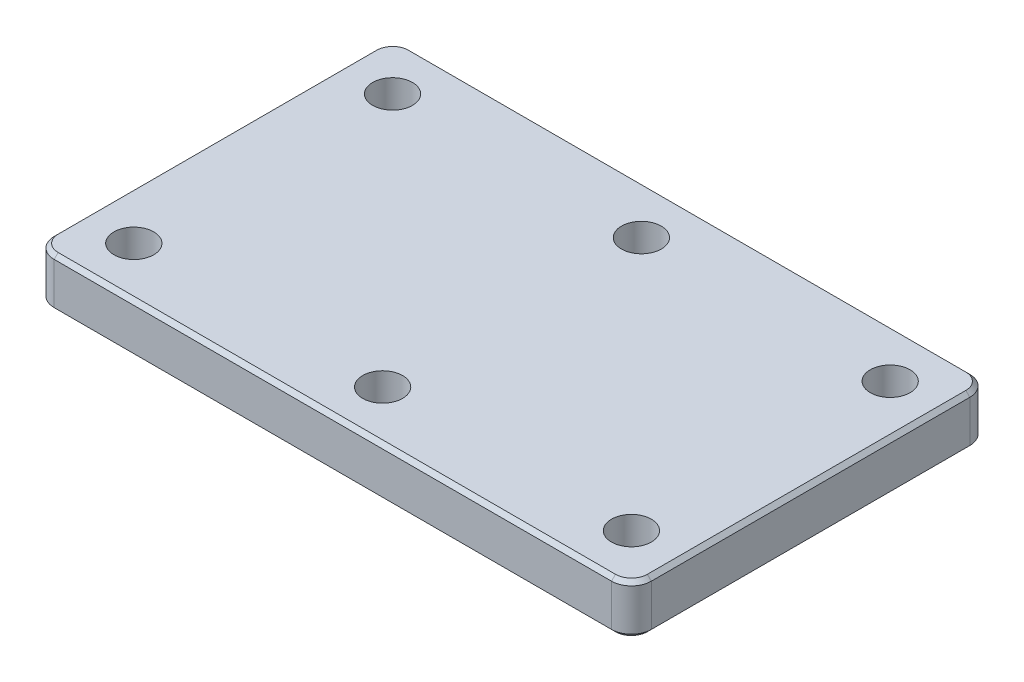
ISO-10303-21;
HEADER;
FILE_DESCRIPTION(('STEP AP214'),'2;1');
FILE_NAME('part.step','',(''),(''),'','','');
FILE_SCHEMA(('AUTOMOTIVE_DESIGN { 1 0 10303 214 1 1 1 1 }'));
ENDSEC;
DATA;
#1=APPLICATION_CONTEXT('core data for automotive mechanical design processes');
#2=APPLICATION_PROTOCOL_DEFINITION('international standard','automotive_design',2000,#1);
#3=PRODUCT_CONTEXT('',#1,'mechanical');
#4=PRODUCT('Part','Part','',(#3));
#5=PRODUCT_RELATED_PRODUCT_CATEGORY('part','',(#4));
#6=PRODUCT_DEFINITION_FORMATION('','',#4);
#7=PRODUCT_DEFINITION_CONTEXT('part definition',#1,'design');
#8=PRODUCT_DEFINITION('design','',#6,#7);
#9=PRODUCT_DEFINITION_SHAPE('','',#8);
#10=(LENGTH_UNIT() NAMED_UNIT(*) SI_UNIT(.MILLI.,.METRE.));
#11=(NAMED_UNIT(*) PLANE_ANGLE_UNIT() SI_UNIT($,.RADIAN.));
#12=(NAMED_UNIT(*) SI_UNIT($,.STERADIAN.) SOLID_ANGLE_UNIT());
#13=UNCERTAINTY_MEASURE_WITH_UNIT(LENGTH_MEASURE(1.E-05),#10,'distance_accuracy_value','');
#14=(GEOMETRIC_REPRESENTATION_CONTEXT(3) GLOBAL_UNCERTAINTY_ASSIGNED_CONTEXT((#13)) GLOBAL_UNIT_ASSIGNED_CONTEXT((#10,
#11,#12)) REPRESENTATION_CONTEXT('',''));
#15=CARTESIAN_POINT('',(0.,0.,0.));
#16=DIRECTION('',(0.,0.,1.));
#17=DIRECTION('',(1.,0.,0.));
#18=AXIS2_PLACEMENT_3D('',#15,#16,#17);
#19=CARTESIAN_POINT('',(290.,12.5,170.));
#20=DIRECTION('',(0.,1.,0.));
#21=DIRECTION('',(0.,0.,1.));
#22=AXIS2_PLACEMENT_3D('',#19,#20,#21);
#23=PLANE('',#22);
#24=CARTESIAN_POINT('',(290.,12.5,10.));
#25=DIRECTION('',(0.,1.,0.));
#26=DIRECTION('',(0.,0.,1.));
#27=AXIS2_PLACEMENT_3D('',#24,#25,#26);
#28=CIRCLE('',#27,8.00000000000006);
#29=CARTESIAN_POINT('',(298.,12.5,10.0000000000001));
#30=VERTEX_POINT('',#29);
#31=CARTESIAN_POINT('',(290.,12.5,1.99999999999994));
#32=VERTEX_POINT('',#31);
#33=EDGE_CURVE('E60',#30,#32,#28,.T.);
#34=ORIENTED_EDGE('',*,*,#33,.T.);
#35=DIRECTION('',(-1.,0.,0.));
#36=VECTOR('',#35,1.);
#37=CARTESIAN_POINT('',(10.,12.5,1.99999999999995));
#38=LINE('',#37,#36);
#39=CARTESIAN_POINT('',(10.,12.5,1.99999999999995));
#40=VERTEX_POINT('',#39);
#41=EDGE_CURVE('E11',#32,#40,#38,.T.);
#42=ORIENTED_EDGE('',*,*,#41,.T.);
#43=CARTESIAN_POINT('',(10.,12.5,10.));
#44=DIRECTION('',(0.,1.,0.));
#45=DIRECTION('',(0.,0.,1.));
#46=AXIS2_PLACEMENT_3D('',#43,#44,#45);
#47=CIRCLE('',#46,8.00000000000005);
#48=CARTESIAN_POINT('',(1.99999999999995,12.5,10.0000000000001));
#49=VERTEX_POINT('',#48);
#50=EDGE_CURVE('E45',#40,#49,#47,.T.);
#51=ORIENTED_EDGE('',*,*,#50,.T.);
#52=DIRECTION('',(0.,0.,1.));
#53=VECTOR('',#52,1.);
#54=CARTESIAN_POINT('',(1.99999999999995,12.5,170.));
#55=LINE('',#54,#53);
#56=CARTESIAN_POINT('',(1.99999999999994,12.5,170.));
#57=VERTEX_POINT('',#56);
#58=EDGE_CURVE('E242',#49,#57,#55,.T.);
#59=ORIENTED_EDGE('',*,*,#58,.T.);
#60=CARTESIAN_POINT('',(10.,12.5,170.));
#61=DIRECTION('',(0.,1.,0.));
#62=DIRECTION('',(0.,0.,1.));
#63=AXIS2_PLACEMENT_3D('',#60,#61,#62);
#64=CIRCLE('',#63,8.00000000000006);
#65=CARTESIAN_POINT('',(10.0000000000001,12.5,178.));
#66=VERTEX_POINT('',#65);
#67=EDGE_CURVE('E238',#57,#66,#64,.T.);
#68=ORIENTED_EDGE('',*,*,#67,.T.);
#69=DIRECTION('',(1.,0.,0.));
#70=VECTOR('',#69,1.);
#71=CARTESIAN_POINT('',(290.,12.5,178.));
#72=LINE('',#71,#70);
#73=CARTESIAN_POINT('',(290.,12.5,178.));
#74=VERTEX_POINT('',#73);
#75=EDGE_CURVE('E234',#66,#74,#72,.T.);
#76=ORIENTED_EDGE('',*,*,#75,.T.);
#77=CARTESIAN_POINT('',(290.,12.5,170.));
#78=DIRECTION('',(0.,1.,0.));
#79=DIRECTION('',(0.,0.,1.));
#80=AXIS2_PLACEMENT_3D('',#77,#78,#79);
#81=CIRCLE('',#80,8.00000000000006);
#82=CARTESIAN_POINT('',(298.,12.5,170.));
#83=VERTEX_POINT('',#82);
#84=EDGE_CURVE('E236',#74,#83,#81,.T.);
#85=ORIENTED_EDGE('',*,*,#84,.T.);
#86=DIRECTION('',(0.,0.,-1.));
#87=VECTOR('',#86,1.);
#88=CARTESIAN_POINT('',(298.,12.5,10.0000000000001));
#89=LINE('',#88,#87);
#90=EDGE_CURVE('E240',#83,#30,#89,.T.);
#91=ORIENTED_EDGE('',*,*,#90,.T.);
#92=EDGE_LOOP('',(#34,#42,#51,#59,#68,#76,#85,#91));
#93=FACE_BOUND('',#92,.T.);
#94=CARTESIAN_POINT('',(150.,12.5,25.));
#95=DIRECTION('',(0.,1.,0.));
#96=DIRECTION('',(0.,0.,1.));
#97=AXIS2_PLACEMENT_3D('',#94,#95,#96);
#98=CIRCLE('',#97,10.);
#99=CARTESIAN_POINT('',(150.,12.5,35.));
#100=VERTEX_POINT('',#99);
#101=EDGE_CURVE('E378',#100,#100,#98,.T.);
#102=ORIENTED_EDGE('',*,*,#101,.F.);
#103=EDGE_LOOP('',(#102));
#104=FACE_BOUND('',#103,.T.);
#105=CARTESIAN_POINT('',(275.,12.5,25.));
#106=DIRECTION('',(0.,1.,0.));
#107=DIRECTION('',(0.,0.,1.));
#108=AXIS2_PLACEMENT_3D('',#105,#106,#107);
#109=CIRCLE('',#108,9.99999999999998);
#110=CARTESIAN_POINT('',(275.,12.5,35.));
#111=VERTEX_POINT('',#110);
#112=EDGE_CURVE('E382',#111,#111,#109,.T.);
#113=ORIENTED_EDGE('',*,*,#112,.F.);
#114=EDGE_LOOP('',(#113));
#115=FACE_BOUND('',#114,.T.);
#116=CARTESIAN_POINT('',(25.,12.5,25.));
#117=DIRECTION('',(0.,1.,0.));
#118=DIRECTION('',(0.,0.,1.));
#119=AXIS2_PLACEMENT_3D('',#116,#117,#118);
#120=CIRCLE('',#119,10.);
#121=CARTESIAN_POINT('',(25.,12.5,35.));
#122=VERTEX_POINT('',#121);
#123=EDGE_CURVE('E311',#122,#122,#120,.T.);
#124=ORIENTED_EDGE('',*,*,#123,.F.);
#125=EDGE_LOOP('',(#124));
#126=FACE_BOUND('',#125,.T.);
#127=CARTESIAN_POINT('',(25.,12.5,155.));
#128=DIRECTION('',(0.,1.,0.));
#129=DIRECTION('',(0.,0.,1.));
#130=AXIS2_PLACEMENT_3D('',#127,#128,#129);
#131=CIRCLE('',#130,10.);
#132=CARTESIAN_POINT('',(25.,12.5,165.));
#133=VERTEX_POINT('',#132);
#134=EDGE_CURVE('E389',#133,#133,#131,.T.);
#135=ORIENTED_EDGE('',*,*,#134,.F.);
#136=EDGE_LOOP('',(#135));
#137=FACE_BOUND('',#136,.T.);
#138=CARTESIAN_POINT('',(275.,12.5,155.));
#139=DIRECTION('',(0.,1.,0.));
#140=DIRECTION('',(0.,0.,1.));
#141=AXIS2_PLACEMENT_3D('',#138,#139,#140);
#142=CIRCLE('',#141,9.99999999999998);
#143=CARTESIAN_POINT('',(275.,12.5,165.));
#144=VERTEX_POINT('',#143);
#145=EDGE_CURVE('E393',#144,#144,#142,.T.);
#146=ORIENTED_EDGE('',*,*,#145,.F.);
#147=EDGE_LOOP('',(#146));
#148=FACE_BOUND('',#147,.T.);
#149=CARTESIAN_POINT('',(150.,12.5,155.));
#150=DIRECTION('',(0.,1.,0.));
#151=DIRECTION('',(0.,0.,1.));
#152=AXIS2_PLACEMENT_3D('',#149,#150,#151);
#153=CIRCLE('',#152,10.);
#154=CARTESIAN_POINT('',(150.,12.5,165.));
#155=VERTEX_POINT('',#154);
#156=EDGE_CURVE('E396',#155,#155,#153,.T.);
#157=ORIENTED_EDGE('',*,*,#156,.F.);
#158=EDGE_LOOP('',(#157));
#159=FACE_BOUND('',#158,.T.);
#160=ADVANCED_FACE('F35',(#93,#104,#115,#126,#137,#148,#159),#23,.T.);
#161=CARTESIAN_POINT('',(290.,-12.5,170.));
#162=DIRECTION('',(0.,1.,0.));
#163=DIRECTION('',(0.,0.,1.));
#164=AXIS2_PLACEMENT_3D('',#161,#162,#163);
#165=PLANE('',#164);
#166=DIRECTION('',(1.,0.,0.));
#167=VECTOR('',#166,1.);
#168=CARTESIAN_POINT('',(290.,-12.5,2.00000000000003));
#169=LINE('',#168,#167);
#170=CARTESIAN_POINT('',(10.,-12.5,2.00000000000003));
#171=VERTEX_POINT('',#170);
#172=CARTESIAN_POINT('',(290.,-12.5,2.00000000000003));
#173=VERTEX_POINT('',#172);
#174=EDGE_CURVE('E205',#171,#173,#169,.T.);
#175=ORIENTED_EDGE('',*,*,#174,.T.);
#176=CARTESIAN_POINT('',(290.,-12.5,10.));
#177=DIRECTION('',(0.,1.,0.));
#178=DIRECTION('',(0.,0.,1.));
#179=AXIS2_PLACEMENT_3D('',#176,#177,#178);
#180=CIRCLE('',#179,7.99999999999995);
#181=CARTESIAN_POINT('',(298.,-12.5,10.0000000000001));
#182=VERTEX_POINT('',#181);
#183=EDGE_CURVE('E178',#173,#182,#180,.F.);
#184=ORIENTED_EDGE('',*,*,#183,.T.);
#185=DIRECTION('',(0.,0.,1.));
#186=VECTOR('',#185,1.);
#187=CARTESIAN_POINT('',(298.,-12.5,170.));
#188=LINE('',#187,#186);
#189=CARTESIAN_POINT('',(298.,-12.5,170.));
#190=VERTEX_POINT('',#189);
#191=EDGE_CURVE('E203',#182,#190,#188,.T.);
#192=ORIENTED_EDGE('',*,*,#191,.T.);
#193=CARTESIAN_POINT('',(290.,-12.5,170.));
#194=DIRECTION('',(0.,1.,0.));
#195=DIRECTION('',(0.,0.,1.));
#196=AXIS2_PLACEMENT_3D('',#193,#194,#195);
#197=CIRCLE('',#196,7.99999999999998);
#198=CARTESIAN_POINT('',(290.,-12.5,178.));
#199=VERTEX_POINT('',#198);
#200=EDGE_CURVE('E199',#190,#199,#197,.F.);
#201=ORIENTED_EDGE('',*,*,#200,.T.);
#202=DIRECTION('',(-1.,0.,0.));
#203=VECTOR('',#202,1.);
#204=CARTESIAN_POINT('',(290.,-12.5,178.));
#205=LINE('',#204,#203);
#206=CARTESIAN_POINT('',(10.0000000000001,-12.5,178.));
#207=VERTEX_POINT('',#206);
#208=EDGE_CURVE('E195',#199,#207,#205,.T.);
#209=ORIENTED_EDGE('',*,*,#208,.T.);
#210=CARTESIAN_POINT('',(10.,-12.5,170.));
#211=DIRECTION('',(0.,1.,0.));
#212=DIRECTION('',(0.,0.,1.));
#213=AXIS2_PLACEMENT_3D('',#210,#211,#212);
#214=CIRCLE('',#213,7.99999999999998);
#215=CARTESIAN_POINT('',(2.00000000000002,-12.5,170.));
#216=VERTEX_POINT('',#215);
#217=EDGE_CURVE('E193',#207,#216,#214,.F.);
#218=ORIENTED_EDGE('',*,*,#217,.T.);
#219=DIRECTION('',(0.,0.,-1.));
#220=VECTOR('',#219,1.);
#221=CARTESIAN_POINT('',(2.,-12.5,170.));
#222=LINE('',#221,#220);
#223=CARTESIAN_POINT('',(2.,-12.5,10.0000000000001));
#224=VERTEX_POINT('',#223);
#225=EDGE_CURVE('E197',#216,#224,#222,.T.);
#226=ORIENTED_EDGE('',*,*,#225,.T.);
#227=CARTESIAN_POINT('',(10.,-12.5,10.));
#228=DIRECTION('',(0.,1.,0.));
#229=DIRECTION('',(0.,0.,1.));
#230=AXIS2_PLACEMENT_3D('',#227,#228,#229);
#231=CIRCLE('',#230,7.99999999999997);
#232=EDGE_CURVE('E201',#224,#171,#231,.F.);
#233=ORIENTED_EDGE('',*,*,#232,.T.);
#234=EDGE_LOOP('',(#175,#184,#192,#201,#209,#218,#226,#233));
#235=FACE_BOUND('',#234,.T.);
#236=CARTESIAN_POINT('',(25.,-12.5,25.));
#237=DIRECTION('',(0.,1.,0.));
#238=DIRECTION('',(0.,0.,1.));
#239=AXIS2_PLACEMENT_3D('',#236,#237,#238);
#240=CIRCLE('',#239,10.);
#241=CARTESIAN_POINT('',(25.,-12.5,35.));
#242=VERTEX_POINT('',#241);
#243=EDGE_CURVE('E416',#242,#242,#240,.T.);
#244=ORIENTED_EDGE('',*,*,#243,.T.);
#245=EDGE_LOOP('',(#244));
#246=FACE_BOUND('',#245,.T.);
#247=CARTESIAN_POINT('',(25.,-12.5,155.));
#248=DIRECTION('',(0.,1.,0.));
#249=DIRECTION('',(0.,0.,1.));
#250=AXIS2_PLACEMENT_3D('',#247,#248,#249);
#251=CIRCLE('',#250,10.);
#252=CARTESIAN_POINT('',(25.,-12.5,165.));
#253=VERTEX_POINT('',#252);
#254=EDGE_CURVE('E412',#253,#253,#251,.T.);
#255=ORIENTED_EDGE('',*,*,#254,.T.);
#256=EDGE_LOOP('',(#255));
#257=FACE_BOUND('',#256,.T.);
#258=CARTESIAN_POINT('',(275.,-12.5,25.));
#259=DIRECTION('',(0.,1.,0.));
#260=DIRECTION('',(0.,0.,1.));
#261=AXIS2_PLACEMENT_3D('',#258,#259,#260);
#262=CIRCLE('',#261,9.99999999999998);
#263=CARTESIAN_POINT('',(275.,-12.5,35.));
#264=VERTEX_POINT('',#263);
#265=EDGE_CURVE('E408',#264,#264,#262,.T.);
#266=ORIENTED_EDGE('',*,*,#265,.T.);
#267=EDGE_LOOP('',(#266));
#268=FACE_BOUND('',#267,.T.);
#269=CARTESIAN_POINT('',(275.,-12.5,155.));
#270=DIRECTION('',(0.,1.,0.));
#271=DIRECTION('',(0.,0.,1.));
#272=AXIS2_PLACEMENT_3D('',#269,#270,#271);
#273=CIRCLE('',#272,9.99999999999998);
#274=CARTESIAN_POINT('',(275.,-12.5,165.));
#275=VERTEX_POINT('',#274);
#276=EDGE_CURVE('E405',#275,#275,#273,.T.);
#277=ORIENTED_EDGE('',*,*,#276,.T.);
#278=EDGE_LOOP('',(#277));
#279=FACE_BOUND('',#278,.T.);
#280=CARTESIAN_POINT('',(150.,-12.5,25.));
#281=DIRECTION('',(0.,1.,0.));
#282=DIRECTION('',(0.,0.,1.));
#283=AXIS2_PLACEMENT_3D('',#280,#281,#282);
#284=CIRCLE('',#283,10.);
#285=CARTESIAN_POINT('',(150.,-12.5,35.));
#286=VERTEX_POINT('',#285);
#287=EDGE_CURVE('E398',#286,#286,#284,.T.);
#288=ORIENTED_EDGE('',*,*,#287,.T.);
#289=EDGE_LOOP('',(#288));
#290=FACE_BOUND('',#289,.T.);
#291=CARTESIAN_POINT('',(150.,-12.5,155.));
#292=DIRECTION('',(0.,1.,0.));
#293=DIRECTION('',(0.,0.,1.));
#294=AXIS2_PLACEMENT_3D('',#291,#292,#293);
#295=CIRCLE('',#294,10.);
#296=CARTESIAN_POINT('',(150.,-12.5,165.));
#297=VERTEX_POINT('',#296);
#298=EDGE_CURVE('E268',#297,#297,#295,.T.);
#299=ORIENTED_EDGE('',*,*,#298,.T.);
#300=EDGE_LOOP('',(#299));
#301=FACE_BOUND('',#300,.T.);
#302=ADVANCED_FACE('F334',(#235,#246,#257,#268,#279,#290,#301),#165,.F.);
#303=CARTESIAN_POINT('',(290.,12.5,170.));
#304=DIRECTION('',(0.,-1.,0.));
#305=DIRECTION('',(0.,0.,-1.));
#306=AXIS2_PLACEMENT_3D('',#303,#304,#305);
#307=CYLINDRICAL_SURFACE('',#306,10.);
#308=DIRECTION('',(0.,-1.,0.));
#309=VECTOR('',#308,1.);
#310=CARTESIAN_POINT('',(290.,12.5,180.));
#311=LINE('',#310,#309);
#312=CARTESIAN_POINT('',(290.,10.5000000000001,180.));
#313=VERTEX_POINT('',#312);
#314=CARTESIAN_POINT('',(290.,-10.5,180.));
#315=VERTEX_POINT('',#314);
#316=EDGE_CURVE('E302',#313,#315,#311,.T.);
#317=ORIENTED_EDGE('',*,*,#316,.T.);
#318=CARTESIAN_POINT('',(290.,-10.5,170.));
#319=DIRECTION('',(0.,1.,0.));
#320=DIRECTION('',(0.,0.,1.));
#321=AXIS2_PLACEMENT_3D('',#318,#319,#320);
#322=CIRCLE('',#321,10.);
#323=CARTESIAN_POINT('',(300.,-10.5,170.));
#324=VERTEX_POINT('',#323);
#325=EDGE_CURVE('E220',#315,#324,#322,.T.);
#326=ORIENTED_EDGE('',*,*,#325,.T.);
#327=DIRECTION('',(0.,-1.,0.));
#328=VECTOR('',#327,1.);
#329=CARTESIAN_POINT('',(300.,12.5,170.));
#330=LINE('',#329,#328);
#331=CARTESIAN_POINT('',(300.,10.5000000000001,170.));
#332=VERTEX_POINT('',#331);
#333=EDGE_CURVE('E168',#332,#324,#330,.T.);
#334=ORIENTED_EDGE('',*,*,#333,.F.);
#335=CARTESIAN_POINT('',(290.,10.5000000000001,170.));
#336=DIRECTION('',(0.,1.,0.));
#337=DIRECTION('',(0.,0.,1.));
#338=AXIS2_PLACEMENT_3D('',#335,#336,#337);
#339=CIRCLE('',#338,10.);
#340=EDGE_CURVE('E218',#332,#313,#339,.F.);
#341=ORIENTED_EDGE('',*,*,#340,.T.);
#342=EDGE_LOOP('',(#317,#326,#334,#341));
#343=FACE_BOUND('',#342,.T.);
#344=ADVANCED_FACE('F347',(#343),#307,.T.);
#345=CARTESIAN_POINT('',(300.,12.5,10.0000000000001));
#346=DIRECTION('',(-1.,0.,0.));
#347=DIRECTION('',(0.,0.,1.));
#348=AXIS2_PLACEMENT_3D('',#345,#346,#347);
#349=PLANE('',#348);
#350=ORIENTED_EDGE('',*,*,#333,.T.);
#351=DIRECTION('',(0.,0.,-1.));
#352=VECTOR('',#351,1.);
#353=CARTESIAN_POINT('',(300.,-10.5,10.0000000000001));
#354=LINE('',#353,#352);
#355=CARTESIAN_POINT('',(300.,-10.5,10.0000000000001));
#356=VERTEX_POINT('',#355);
#357=EDGE_CURVE('E212',#324,#356,#354,.T.);
#358=ORIENTED_EDGE('',*,*,#357,.T.);
#359=DIRECTION('',(0.,-1.,0.));
#360=VECTOR('',#359,1.);
#361=CARTESIAN_POINT('',(300.,12.5,10.0000000000001));
#362=LINE('',#361,#360);
#363=CARTESIAN_POINT('',(300.,10.5000000000001,10.0000000000001));
#364=VERTEX_POINT('',#363);
#365=EDGE_CURVE('E183',#364,#356,#362,.T.);
#366=ORIENTED_EDGE('',*,*,#365,.F.);
#367=DIRECTION('',(0.,0.,1.));
#368=VECTOR('',#367,1.);
#369=CARTESIAN_POINT('',(300.,10.5000000000001,170.));
#370=LINE('',#369,#368);
#371=EDGE_CURVE('E210',#364,#332,#370,.T.);
#372=ORIENTED_EDGE('',*,*,#371,.T.);
#373=EDGE_LOOP('',(#350,#358,#366,#372));
#374=FACE_BOUND('',#373,.T.);
#375=ADVANCED_FACE('F351',(#374),#349,.F.);
#376=CARTESIAN_POINT('',(290.,12.5,10.));
#377=DIRECTION('',(0.,-1.,0.));
#378=DIRECTION('',(0.,0.,-1.));
#379=AXIS2_PLACEMENT_3D('',#376,#377,#378);
#380=CYLINDRICAL_SURFACE('',#379,10.);
#381=ORIENTED_EDGE('',*,*,#365,.T.);
#382=CARTESIAN_POINT('',(290.,-10.5,10.));
#383=DIRECTION('',(0.,1.,0.));
#384=DIRECTION('',(0.,0.,1.));
#385=AXIS2_PLACEMENT_3D('',#382,#383,#384);
#386=CIRCLE('',#385,10.);
#387=CARTESIAN_POINT('',(290.,-10.5,0.));
#388=VERTEX_POINT('',#387);
#389=EDGE_CURVE('E167',#356,#388,#386,.T.);
#390=ORIENTED_EDGE('',*,*,#389,.T.);
#391=DIRECTION('',(0.,-1.,0.));
#392=VECTOR('',#391,1.);
#393=CARTESIAN_POINT('',(290.,12.5,0.));
#394=LINE('',#393,#392);
#395=CARTESIAN_POINT('',(290.,10.5000000000001,0.));
#396=VERTEX_POINT('',#395);
#397=EDGE_CURVE('E174',#396,#388,#394,.T.);
#398=ORIENTED_EDGE('',*,*,#397,.F.);
#399=CARTESIAN_POINT('',(290.,10.5000000000001,10.));
#400=DIRECTION('',(0.,1.,0.));
#401=DIRECTION('',(0.,0.,1.));
#402=AXIS2_PLACEMENT_3D('',#399,#400,#401);
#403=CIRCLE('',#402,10.);
#404=EDGE_CURVE('E159',#396,#364,#403,.F.);
#405=ORIENTED_EDGE('',*,*,#404,.T.);
#406=EDGE_LOOP('',(#381,#390,#398,#405));
#407=FACE_BOUND('',#406,.T.);
#408=ADVANCED_FACE('F181',(#407),#380,.T.);
#409=CARTESIAN_POINT('',(10.0000000000001,12.5,0.));
#410=DIRECTION('',(0.,0.,1.));
#411=DIRECTION('',(1.,0.,0.));
#412=AXIS2_PLACEMENT_3D('',#409,#410,#411);
#413=PLANE('',#412);
#414=ORIENTED_EDGE('',*,*,#397,.T.);
#415=DIRECTION('',(-1.,0.,0.));
#416=VECTOR('',#415,1.);
#417=CARTESIAN_POINT('',(10.0000000000001,-10.5,0.));
#418=LINE('',#417,#416);
#419=CARTESIAN_POINT('',(10.,-10.5,0.));
#420=VERTEX_POINT('',#419);
#421=EDGE_CURVE('E177',#388,#420,#418,.T.);
#422=ORIENTED_EDGE('',*,*,#421,.T.);
#423=DIRECTION('',(0.,-1.,0.));
#424=VECTOR('',#423,1.);
#425=CARTESIAN_POINT('',(10.,12.5,0.));
#426=LINE('',#425,#424);
#427=CARTESIAN_POINT('',(10.,10.5000000000001,0.));
#428=VERTEX_POINT('',#427);
#429=EDGE_CURVE('E176',#428,#420,#426,.T.);
#430=ORIENTED_EDGE('',*,*,#429,.F.);
#431=DIRECTION('',(1.,0.,0.));
#432=VECTOR('',#431,1.);
#433=CARTESIAN_POINT('',(290.,10.5000000000001,0.));
#434=LINE('',#433,#432);
#435=EDGE_CURVE('E154',#428,#396,#434,.T.);
#436=ORIENTED_EDGE('',*,*,#435,.T.);
#437=EDGE_LOOP('',(#414,#422,#430,#436));
#438=FACE_BOUND('',#437,.T.);
#439=ADVANCED_FACE('F173',(#438),#413,.F.);
#440=CARTESIAN_POINT('',(10.,12.5,10.));
#441=DIRECTION('',(0.,-1.,0.));
#442=DIRECTION('',(0.,0.,-1.));
#443=AXIS2_PLACEMENT_3D('',#440,#441,#442);
#444=CYLINDRICAL_SURFACE('',#443,10.);
#445=ORIENTED_EDGE('',*,*,#429,.T.);
#446=CARTESIAN_POINT('',(10.,-10.5,10.));
#447=DIRECTION('',(0.,1.,0.));
#448=DIRECTION('',(0.,0.,1.));
#449=AXIS2_PLACEMENT_3D('',#446,#447,#448);
#450=CIRCLE('',#449,10.);
#451=CARTESIAN_POINT('',(0.,-10.5,10.0000000000001));
#452=VERTEX_POINT('',#451);
#453=EDGE_CURVE('E216',#420,#452,#450,.T.);
#454=ORIENTED_EDGE('',*,*,#453,.T.);
#455=DIRECTION('',(0.,-1.,0.));
#456=VECTOR('',#455,1.);
#457=CARTESIAN_POINT('',(0.,12.5,10.0000000000001));
#458=LINE('',#457,#456);
#459=CARTESIAN_POINT('',(0.,10.5000000000001,10.0000000000001));
#460=VERTEX_POINT('',#459);
#461=EDGE_CURVE('E186',#460,#452,#458,.T.);
#462=ORIENTED_EDGE('',*,*,#461,.F.);
#463=CARTESIAN_POINT('',(10.,10.5000000000001,10.));
#464=DIRECTION('',(0.,1.,0.));
#465=DIRECTION('',(0.,0.,1.));
#466=AXIS2_PLACEMENT_3D('',#463,#464,#465);
#467=CIRCLE('',#466,10.);
#468=EDGE_CURVE('E214',#460,#428,#467,.F.);
#469=ORIENTED_EDGE('',*,*,#468,.T.);
#470=EDGE_LOOP('',(#445,#454,#462,#469));
#471=FACE_BOUND('',#470,.T.);
#472=ADVANCED_FACE('F367',(#471),#444,.T.);
#473=CARTESIAN_POINT('',(0.,12.5,170.));
#474=DIRECTION('',(1.,0.,0.));
#475=DIRECTION('',(0.,0.,-1.));
#476=AXIS2_PLACEMENT_3D('',#473,#474,#475);
#477=PLANE('',#476);
#478=ORIENTED_EDGE('',*,*,#461,.T.);
#479=DIRECTION('',(0.,0.,1.));
#480=VECTOR('',#479,1.);
#481=CARTESIAN_POINT('',(0.,-10.5,170.));
#482=LINE('',#481,#480);
#483=CARTESIAN_POINT('',(0.,-10.5,170.));
#484=VERTEX_POINT('',#483);
#485=EDGE_CURVE('E224',#452,#484,#482,.T.);
#486=ORIENTED_EDGE('',*,*,#485,.T.);
#487=DIRECTION('',(0.,-1.,0.));
#488=VECTOR('',#487,1.);
#489=CARTESIAN_POINT('',(0.,12.5,170.));
#490=LINE('',#489,#488);
#491=CARTESIAN_POINT('',(0.,10.5000000000001,170.));
#492=VERTEX_POINT('',#491);
#493=EDGE_CURVE('E308',#492,#484,#490,.T.);
#494=ORIENTED_EDGE('',*,*,#493,.F.);
#495=DIRECTION('',(0.,0.,-1.));
#496=VECTOR('',#495,1.);
#497=CARTESIAN_POINT('',(0.,10.5000000000001,10.0000000000001));
#498=LINE('',#497,#496);
#499=EDGE_CURVE('E222',#492,#460,#498,.T.);
#500=ORIENTED_EDGE('',*,*,#499,.T.);
#501=EDGE_LOOP('',(#478,#486,#494,#500));
#502=FACE_BOUND('',#501,.T.);
#503=ADVANCED_FACE('F318',(#502),#477,.F.);
#504=CARTESIAN_POINT('',(10.,12.5,170.));
#505=DIRECTION('',(0.,-1.,0.));
#506=DIRECTION('',(0.,0.,-1.));
#507=AXIS2_PLACEMENT_3D('',#504,#505,#506);
#508=CYLINDRICAL_SURFACE('',#507,10.);
#509=ORIENTED_EDGE('',*,*,#493,.T.);
#510=CARTESIAN_POINT('',(10.,-10.5,170.));
#511=DIRECTION('',(0.,1.,0.));
#512=DIRECTION('',(0.,0.,1.));
#513=AXIS2_PLACEMENT_3D('',#510,#511,#512);
#514=CIRCLE('',#513,10.);
#515=CARTESIAN_POINT('',(10.0000000000001,-10.5,180.));
#516=VERTEX_POINT('',#515);
#517=EDGE_CURVE('E232',#484,#516,#514,.T.);
#518=ORIENTED_EDGE('',*,*,#517,.T.);
#519=DIRECTION('',(0.,-1.,0.));
#520=VECTOR('',#519,1.);
#521=CARTESIAN_POINT('',(10.0000000000001,12.5,180.));
#522=LINE('',#521,#520);
#523=CARTESIAN_POINT('',(10.0000000000001,10.5000000000001,180.));
#524=VERTEX_POINT('',#523);
#525=EDGE_CURVE('E299',#524,#516,#522,.T.);
#526=ORIENTED_EDGE('',*,*,#525,.F.);
#527=CARTESIAN_POINT('',(10.,10.5000000000001,170.));
#528=DIRECTION('',(0.,1.,0.));
#529=DIRECTION('',(0.,0.,1.));
#530=AXIS2_PLACEMENT_3D('',#527,#528,#529);
#531=CIRCLE('',#530,10.);
#532=EDGE_CURVE('E230',#524,#492,#531,.F.);
#533=ORIENTED_EDGE('',*,*,#532,.T.);
#534=EDGE_LOOP('',(#509,#518,#526,#533));
#535=FACE_BOUND('',#534,.T.);
#536=ADVANCED_FACE('F305',(#535),#508,.T.);
#537=CARTESIAN_POINT('',(290.,12.5,180.));
#538=DIRECTION('',(0.,0.,-1.));
#539=DIRECTION('',(-1.,0.,0.));
#540=AXIS2_PLACEMENT_3D('',#537,#538,#539);
#541=PLANE('',#540);
#542=ORIENTED_EDGE('',*,*,#525,.T.);
#543=DIRECTION('',(1.,0.,0.));
#544=VECTOR('',#543,1.);
#545=CARTESIAN_POINT('',(290.,-10.5,180.));
#546=LINE('',#545,#544);
#547=EDGE_CURVE('E228',#516,#315,#546,.T.);
#548=ORIENTED_EDGE('',*,*,#547,.T.);
#549=ORIENTED_EDGE('',*,*,#316,.F.);
#550=DIRECTION('',(-1.,0.,0.));
#551=VECTOR('',#550,1.);
#552=CARTESIAN_POINT('',(10.0000000000001,10.5000000000001,180.));
#553=LINE('',#552,#551);
#554=EDGE_CURVE('E226',#313,#524,#553,.T.);
#555=ORIENTED_EDGE('',*,*,#554,.T.);
#556=EDGE_LOOP('',(#542,#548,#549,#555));
#557=FACE_BOUND('',#556,.T.);
#558=ADVANCED_FACE('F298',(#557),#541,.F.);
#559=CARTESIAN_POINT('',(25.,12.5,25.));
#560=DIRECTION('',(0.,-1.,0.));
#561=DIRECTION('',(0.,0.,-1.));
#562=AXIS2_PLACEMENT_3D('',#559,#560,#561);
#563=CYLINDRICAL_SURFACE('',#562,10.);
#564=ORIENTED_EDGE('',*,*,#123,.T.);
#565=EDGE_LOOP('',(#564));
#566=FACE_BOUND('',#565,.T.);
#567=ORIENTED_EDGE('',*,*,#243,.F.);
#568=EDGE_LOOP('',(#567));
#569=FACE_BOUND('',#568,.T.);
#570=ADVANCED_FACE('F423',(#566,#569),#563,.F.);
#571=CARTESIAN_POINT('',(25.,12.5,155.));
#572=DIRECTION('',(0.,-1.,0.));
#573=DIRECTION('',(0.,0.,-1.));
#574=AXIS2_PLACEMENT_3D('',#571,#572,#573);
#575=CYLINDRICAL_SURFACE('',#574,10.);
#576=ORIENTED_EDGE('',*,*,#134,.T.);
#577=EDGE_LOOP('',(#576));
#578=FACE_BOUND('',#577,.T.);
#579=ORIENTED_EDGE('',*,*,#254,.F.);
#580=EDGE_LOOP('',(#579));
#581=FACE_BOUND('',#580,.T.);
#582=ADVANCED_FACE('F425',(#578,#581),#575,.F.);
#583=CARTESIAN_POINT('',(275.,12.5,25.));
#584=DIRECTION('',(0.,-1.,0.));
#585=DIRECTION('',(0.,0.,-1.));
#586=AXIS2_PLACEMENT_3D('',#583,#584,#585);
#587=CYLINDRICAL_SURFACE('',#586,9.99999999999998);
#588=ORIENTED_EDGE('',*,*,#112,.T.);
#589=EDGE_LOOP('',(#588));
#590=FACE_BOUND('',#589,.T.);
#591=ORIENTED_EDGE('',*,*,#265,.F.);
#592=EDGE_LOOP('',(#591));
#593=FACE_BOUND('',#592,.T.);
#594=ADVANCED_FACE('F432',(#590,#593),#587,.F.);
#595=CARTESIAN_POINT('',(275.,12.5,155.));
#596=DIRECTION('',(0.,-1.,0.));
#597=DIRECTION('',(0.,0.,-1.));
#598=AXIS2_PLACEMENT_3D('',#595,#596,#597);
#599=CYLINDRICAL_SURFACE('',#598,9.99999999999998);
#600=ORIENTED_EDGE('',*,*,#145,.T.);
#601=EDGE_LOOP('',(#600));
#602=FACE_BOUND('',#601,.T.);
#603=ORIENTED_EDGE('',*,*,#276,.F.);
#604=EDGE_LOOP('',(#603));
#605=FACE_BOUND('',#604,.T.);
#606=ADVANCED_FACE('F585',(#602,#605),#599,.F.);
#607=CARTESIAN_POINT('',(150.,12.5,25.));
#608=DIRECTION('',(0.,-1.,0.));
#609=DIRECTION('',(0.,0.,-1.));
#610=AXIS2_PLACEMENT_3D('',#607,#608,#609);
#611=CYLINDRICAL_SURFACE('',#610,10.);
#612=ORIENTED_EDGE('',*,*,#101,.T.);
#613=EDGE_LOOP('',(#612));
#614=FACE_BOUND('',#613,.T.);
#615=ORIENTED_EDGE('',*,*,#287,.F.);
#616=EDGE_LOOP('',(#615));
#617=FACE_BOUND('',#616,.T.);
#618=ADVANCED_FACE('F577',(#614,#617),#611,.F.);
#619=CARTESIAN_POINT('',(150.,12.5,155.));
#620=DIRECTION('',(0.,-1.,0.));
#621=DIRECTION('',(0.,0.,-1.));
#622=AXIS2_PLACEMENT_3D('',#619,#620,#621);
#623=CYLINDRICAL_SURFACE('',#622,10.);
#624=ORIENTED_EDGE('',*,*,#156,.T.);
#625=EDGE_LOOP('',(#624));
#626=FACE_BOUND('',#625,.T.);
#627=ORIENTED_EDGE('',*,*,#298,.F.);
#628=EDGE_LOOP('',(#627));
#629=FACE_BOUND('',#628,.T.);
#630=ADVANCED_FACE('F494',(#626,#629),#623,.F.);
#631=CARTESIAN_POINT('',(10.,-10.5,170.));
#632=DIRECTION('',(0.,1.,0.));
#633=DIRECTION('',(0.,0.,1.));
#634=AXIS2_PLACEMENT_3D('',#631,#632,#633);
#635=CONICAL_SURFACE('',#634,10.,0.78539816339745);
#636=DIRECTION('',(-0.707106781186549,0.707106781186546,0.));
#637=VECTOR('',#636,1.);
#638=CARTESIAN_POINT('',(2.00000000000002,-12.5,170.));
#639=LINE('',#638,#637);
#640=EDGE_CURVE('E262',#216,#484,#639,.T.);
#641=ORIENTED_EDGE('',*,*,#640,.F.);
#642=ORIENTED_EDGE('',*,*,#217,.F.);
#643=DIRECTION('',(0.,-0.707106781186546,-0.707106781186549));
#644=VECTOR('',#643,1.);
#645=CARTESIAN_POINT('',(10.0000000000001,-10.5,180.));
#646=LINE('',#645,#644);
#647=EDGE_CURVE('E265',#516,#207,#646,.T.);
#648=ORIENTED_EDGE('',*,*,#647,.F.);
#649=ORIENTED_EDGE('',*,*,#517,.F.);
#650=EDGE_LOOP('',(#641,#642,#648,#649));
#651=FACE_BOUND('',#650,.T.);
#652=ADVANCED_FACE('F340',(#651),#635,.T.);
#653=CARTESIAN_POINT('',(290.,-10.5,180.));
#654=DIRECTION('',(0.,0.707106781186549,-0.707106781186546));
#655=DIRECTION('',(1.,0.,0.));
#656=AXIS2_PLACEMENT_3D('',#653,#654,#655);
#657=PLANE('',#656);
#658=ORIENTED_EDGE('',*,*,#647,.T.);
#659=ORIENTED_EDGE('',*,*,#208,.F.);
#660=DIRECTION('',(0.,-0.707106781186546,-0.707106781186549));
#661=VECTOR('',#660,1.);
#662=CARTESIAN_POINT('',(290.,-10.5,180.));
#663=LINE('',#662,#661);
#664=EDGE_CURVE('E259',#315,#199,#663,.T.);
#665=ORIENTED_EDGE('',*,*,#664,.F.);
#666=ORIENTED_EDGE('',*,*,#547,.F.);
#667=EDGE_LOOP('',(#658,#659,#665,#666));
#668=FACE_BOUND('',#667,.T.);
#669=ADVANCED_FACE('F344',(#668),#657,.F.);
#670=CARTESIAN_POINT('',(0.,-10.5,170.));
#671=DIRECTION('',(0.707106781186551,0.707106781186544,0.));
#672=DIRECTION('',(0.,0.,1.));
#673=AXIS2_PLACEMENT_3D('',#670,#671,#672);
#674=PLANE('',#673);
#675=ORIENTED_EDGE('',*,*,#640,.T.);
#676=ORIENTED_EDGE('',*,*,#485,.F.);
#677=DIRECTION('',(-0.707106781186544,0.707106781186551,0.));
#678=VECTOR('',#677,1.);
#679=CARTESIAN_POINT('',(2.,-12.5,10.0000000000001));
#680=LINE('',#679,#678);
#681=EDGE_CURVE('E256',#224,#452,#680,.T.);
#682=ORIENTED_EDGE('',*,*,#681,.F.);
#683=ORIENTED_EDGE('',*,*,#225,.F.);
#684=EDGE_LOOP('',(#675,#676,#682,#683));
#685=FACE_BOUND('',#684,.T.);
#686=ADVANCED_FACE('F324',(#685),#674,.F.);
#687=CARTESIAN_POINT('',(290.,-10.5,170.));
#688=DIRECTION('',(0.,1.,0.));
#689=DIRECTION('',(0.,0.,1.));
#690=AXIS2_PLACEMENT_3D('',#687,#688,#689);
#691=CONICAL_SURFACE('',#690,10.,0.785398163397451);
#692=ORIENTED_EDGE('',*,*,#664,.T.);
#693=ORIENTED_EDGE('',*,*,#200,.F.);
#694=DIRECTION('',(-0.707106781186544,-0.707106781186551,0.));
#695=VECTOR('',#694,1.);
#696=CARTESIAN_POINT('',(300.,-10.5,170.));
#697=LINE('',#696,#695);
#698=EDGE_CURVE('E253',#324,#190,#697,.T.);
#699=ORIENTED_EDGE('',*,*,#698,.F.);
#700=ORIENTED_EDGE('',*,*,#325,.F.);
#701=EDGE_LOOP('',(#692,#693,#699,#700));
#702=FACE_BOUND('',#701,.T.);
#703=ADVANCED_FACE('F356',(#702),#691,.T.);
#704=CARTESIAN_POINT('',(10.,-10.5,10.));
#705=DIRECTION('',(0.,1.,0.));
#706=DIRECTION('',(0.,0.,1.));
#707=AXIS2_PLACEMENT_3D('',#704,#705,#706);
#708=CONICAL_SURFACE('',#707,10.,0.78539816339745);
#709=ORIENTED_EDGE('',*,*,#681,.T.);
#710=ORIENTED_EDGE('',*,*,#453,.F.);
#711=DIRECTION('',(0.,0.707106781186546,-0.707106781186549));
#712=VECTOR('',#711,1.);
#713=CARTESIAN_POINT('',(10.,-12.5,2.00000000000003));
#714=LINE('',#713,#712);
#715=EDGE_CURVE('E250',#171,#420,#714,.T.);
#716=ORIENTED_EDGE('',*,*,#715,.F.);
#717=ORIENTED_EDGE('',*,*,#232,.F.);
#718=EDGE_LOOP('',(#709,#710,#716,#717));
#719=FACE_BOUND('',#718,.T.);
#720=ADVANCED_FACE('F330',(#719),#708,.T.);
#721=CARTESIAN_POINT('',(300.,-10.5,10.0000000000001));
#722=DIRECTION('',(-0.707106781186551,0.707106781186544,0.));
#723=DIRECTION('',(0.,0.,-1.));
#724=AXIS2_PLACEMENT_3D('',#721,#722,#723);
#725=PLANE('',#724);
#726=ORIENTED_EDGE('',*,*,#698,.T.);
#727=ORIENTED_EDGE('',*,*,#191,.F.);
#728=DIRECTION('',(-0.707106781186544,-0.707106781186551,0.));
#729=VECTOR('',#728,1.);
#730=CARTESIAN_POINT('',(300.,-10.5,10.0000000000001));
#731=LINE('',#730,#729);
#732=EDGE_CURVE('E248',#356,#182,#731,.T.);
#733=ORIENTED_EDGE('',*,*,#732,.F.);
#734=ORIENTED_EDGE('',*,*,#357,.F.);
#735=EDGE_LOOP('',(#726,#727,#733,#734));
#736=FACE_BOUND('',#735,.T.);
#737=ADVANCED_FACE('F360',(#736),#725,.F.);
#738=CARTESIAN_POINT('',(10.0000000000001,-10.5,0.));
#739=DIRECTION('',(0.,0.707106781186549,0.707106781186546));
#740=DIRECTION('',(-1.,0.,0.));
#741=AXIS2_PLACEMENT_3D('',#738,#739,#740);
#742=PLANE('',#741);
#743=ORIENTED_EDGE('',*,*,#715,.T.);
#744=ORIENTED_EDGE('',*,*,#421,.F.);
#745=DIRECTION('',(0.,0.707106781186546,-0.707106781186549));
#746=VECTOR('',#745,1.);
#747=CARTESIAN_POINT('',(290.,-12.5,2.00000000000003));
#748=LINE('',#747,#746);
#749=EDGE_CURVE('E246',#173,#388,#748,.T.);
#750=ORIENTED_EDGE('',*,*,#749,.F.);
#751=ORIENTED_EDGE('',*,*,#174,.F.);
#752=EDGE_LOOP('',(#743,#744,#750,#751));
#753=FACE_BOUND('',#752,.T.);
#754=ADVANCED_FACE('F366',(#753),#742,.F.);
#755=CARTESIAN_POINT('',(290.,-10.5,10.));
#756=DIRECTION('',(0.,1.,0.));
#757=DIRECTION('',(0.,0.,1.));
#758=AXIS2_PLACEMENT_3D('',#755,#756,#757);
#759=CONICAL_SURFACE('',#758,10.,0.785398163397457);
#760=ORIENTED_EDGE('',*,*,#732,.T.);
#761=ORIENTED_EDGE('',*,*,#183,.F.);
#762=ORIENTED_EDGE('',*,*,#749,.T.);
#763=ORIENTED_EDGE('',*,*,#389,.F.);
#764=EDGE_LOOP('',(#760,#761,#762,#763));
#765=FACE_BOUND('',#764,.T.);
#766=ADVANCED_FACE('F362',(#765),#759,.T.);
#767=CARTESIAN_POINT('',(290.,12.5,178.));
#768=DIRECTION('',(0.,0.707106781186548,0.707106781186548));
#769=DIRECTION('',(-1.,0.,0.));
#770=AXIS2_PLACEMENT_3D('',#767,#768,#769);
#771=PLANE('',#770);
#772=DIRECTION('',(0.,0.707106781186548,-0.707106781186548));
#773=VECTOR('',#772,1.);
#774=CARTESIAN_POINT('',(10.0000000000001,10.5000000000001,180.));
#775=LINE('',#774,#773);
#776=EDGE_CURVE('E278',#524,#66,#775,.T.);
#777=ORIENTED_EDGE('',*,*,#776,.F.);
#778=ORIENTED_EDGE('',*,*,#554,.F.);
#779=DIRECTION('',(0.,-0.707106781186548,0.707106781186548));
#780=VECTOR('',#779,1.);
#781=CARTESIAN_POINT('',(290.,12.5,178.));
#782=LINE('',#781,#780);
#783=EDGE_CURVE('E40',#74,#313,#782,.T.);
#784=ORIENTED_EDGE('',*,*,#783,.F.);
#785=ORIENTED_EDGE('',*,*,#75,.F.);
#786=EDGE_LOOP('',(#777,#778,#784,#785));
#787=FACE_BOUND('',#786,.T.);
#788=ADVANCED_FACE('F38',(#787),#771,.T.);
#789=CARTESIAN_POINT('',(290.,12.5,170.));
#790=DIRECTION('',(0.,-1.,0.));
#791=DIRECTION('',(0.,0.,-1.));
#792=AXIS2_PLACEMENT_3D('',#789,#790,#791);
#793=CONICAL_SURFACE('',#792,8.00000000000006,0.785398163397448);
#794=ORIENTED_EDGE('',*,*,#783,.T.);
#795=ORIENTED_EDGE('',*,*,#340,.F.);
#796=DIRECTION('',(0.707106781186548,-0.707106781186548,0.));
#797=VECTOR('',#796,1.);
#798=CARTESIAN_POINT('',(298.,12.5,170.));
#799=LINE('',#798,#797);
#800=EDGE_CURVE('E276',#83,#332,#799,.T.);
#801=ORIENTED_EDGE('',*,*,#800,.F.);
#802=ORIENTED_EDGE('',*,*,#84,.F.);
#803=EDGE_LOOP('',(#794,#795,#801,#802));
#804=FACE_BOUND('',#803,.T.);
#805=ADVANCED_FACE('F289',(#804),#793,.T.);
#806=CARTESIAN_POINT('',(10.,12.5,170.));
#807=DIRECTION('',(0.,-1.,0.));
#808=DIRECTION('',(0.,0.,-1.));
#809=AXIS2_PLACEMENT_3D('',#806,#807,#808);
#810=CONICAL_SURFACE('',#809,8.00000000000006,0.785398163397447);
#811=ORIENTED_EDGE('',*,*,#776,.T.);
#812=ORIENTED_EDGE('',*,*,#67,.F.);
#813=DIRECTION('',(0.707106781186547,0.707106781186548,0.));
#814=VECTOR('',#813,1.);
#815=CARTESIAN_POINT('',(0.,10.5000000000001,170.));
#816=LINE('',#815,#814);
#817=EDGE_CURVE('E273',#492,#57,#816,.T.);
#818=ORIENTED_EDGE('',*,*,#817,.F.);
#819=ORIENTED_EDGE('',*,*,#532,.F.);
#820=EDGE_LOOP('',(#811,#812,#818,#819));
#821=FACE_BOUND('',#820,.T.);
#822=ADVANCED_FACE('F524',(#821),#810,.T.);
#823=CARTESIAN_POINT('',(298.,12.5,170.));
#824=DIRECTION('',(0.707106781186548,0.707106781186548,0.));
#825=DIRECTION('',(0.,0.,1.));
#826=AXIS2_PLACEMENT_3D('',#823,#824,#825);
#827=PLANE('',#826);
#828=ORIENTED_EDGE('',*,*,#800,.T.);
#829=ORIENTED_EDGE('',*,*,#371,.F.);
#830=DIRECTION('',(0.707106781186548,-0.707106781186548,0.));
#831=VECTOR('',#830,1.);
#832=CARTESIAN_POINT('',(298.,12.5,10.0000000000001));
#833=LINE('',#832,#831);
#834=EDGE_CURVE('E162',#30,#364,#833,.T.);
#835=ORIENTED_EDGE('',*,*,#834,.F.);
#836=ORIENTED_EDGE('',*,*,#90,.F.);
#837=EDGE_LOOP('',(#828,#829,#835,#836));
#838=FACE_BOUND('',#837,.T.);
#839=ADVANCED_FACE('F517',(#838),#827,.T.);
#840=CARTESIAN_POINT('',(1.99999999999995,12.5,170.));
#841=DIRECTION('',(-0.707106781186548,0.707106781186548,0.));
#842=DIRECTION('',(0.,0.,-1.));
#843=AXIS2_PLACEMENT_3D('',#840,#841,#842);
#844=PLANE('',#843);
#845=ORIENTED_EDGE('',*,*,#817,.T.);
#846=ORIENTED_EDGE('',*,*,#58,.F.);
#847=DIRECTION('',(0.707106781186548,0.707106781186548,0.));
#848=VECTOR('',#847,1.);
#849=CARTESIAN_POINT('',(0.,10.5000000000001,10.0000000000001));
#850=LINE('',#849,#848);
#851=EDGE_CURVE('E156',#460,#49,#850,.T.);
#852=ORIENTED_EDGE('',*,*,#851,.F.);
#853=ORIENTED_EDGE('',*,*,#499,.F.);
#854=EDGE_LOOP('',(#845,#846,#852,#853));
#855=FACE_BOUND('',#854,.T.);
#856=ADVANCED_FACE('F511',(#855),#844,.T.);
#857=CARTESIAN_POINT('',(290.,12.5,10.));
#858=DIRECTION('',(0.,-1.,0.));
#859=DIRECTION('',(0.,0.,-1.));
#860=AXIS2_PLACEMENT_3D('',#857,#858,#859);
#861=CONICAL_SURFACE('',#860,8.00000000000006,0.785398163397448);
#862=ORIENTED_EDGE('',*,*,#834,.T.);
#863=ORIENTED_EDGE('',*,*,#404,.F.);
#864=DIRECTION('',(0.,-0.707106781186547,-0.707106781186548));
#865=VECTOR('',#864,1.);
#866=CARTESIAN_POINT('',(290.,12.5,1.99999999999994));
#867=LINE('',#866,#865);
#868=EDGE_CURVE('E150',#32,#396,#867,.T.);
#869=ORIENTED_EDGE('',*,*,#868,.F.);
#870=ORIENTED_EDGE('',*,*,#33,.F.);
#871=EDGE_LOOP('',(#862,#863,#869,#870));
#872=FACE_BOUND('',#871,.T.);
#873=ADVANCED_FACE('F160',(#872),#861,.T.);
#874=CARTESIAN_POINT('',(10.,12.5,10.));
#875=DIRECTION('',(0.,-1.,0.));
#876=DIRECTION('',(0.,0.,-1.));
#877=AXIS2_PLACEMENT_3D('',#874,#875,#876);
#878=CONICAL_SURFACE('',#877,8.00000000000005,0.785398163397448);
#879=ORIENTED_EDGE('',*,*,#851,.T.);
#880=ORIENTED_EDGE('',*,*,#50,.F.);
#881=DIRECTION('',(0.,0.707106781186548,0.707106781186548));
#882=VECTOR('',#881,1.);
#883=CARTESIAN_POINT('',(10.,10.5000000000001,0.));
#884=LINE('',#883,#882);
#885=EDGE_CURVE('E53',#428,#40,#884,.T.);
#886=ORIENTED_EDGE('',*,*,#885,.F.);
#887=ORIENTED_EDGE('',*,*,#468,.F.);
#888=EDGE_LOOP('',(#879,#880,#886,#887));
#889=FACE_BOUND('',#888,.T.);
#890=ADVANCED_FACE('F370',(#889),#878,.T.);
#891=CARTESIAN_POINT('',(290.,12.5,1.99999999999995));
#892=DIRECTION('',(0.,0.707106781186548,-0.707106781186548));
#893=DIRECTION('',(1.,0.,0.));
#894=AXIS2_PLACEMENT_3D('',#891,#892,#893);
#895=PLANE('',#894);
#896=ORIENTED_EDGE('',*,*,#868,.T.);
#897=ORIENTED_EDGE('',*,*,#435,.F.);
#898=ORIENTED_EDGE('',*,*,#885,.T.);
#899=ORIENTED_EDGE('',*,*,#41,.F.);
#900=EDGE_LOOP('',(#896,#897,#898,#899));
#901=FACE_BOUND('',#900,.T.);
#902=ADVANCED_FACE('F152',(#901),#895,.T.);
#903=CLOSED_SHELL('',(#160,#302,#344,#375,#408,#439,#472,#503,#536,#558,#570,#582,#594,#606,
#618,#630,#652,#669,#686,#703,#720,#737,#754,#766,#788,#805,#822,#839,#856,#873,#890,#902));
#904=MANIFOLD_SOLID_BREP('B2',#903);
#905=ADVANCED_BREP_SHAPE_REPRESENTATION('',(#18,#904),#14);
#906=SHAPE_DEFINITION_REPRESENTATION(#9,#905);
ENDSEC;
END-ISO-10303-21;
